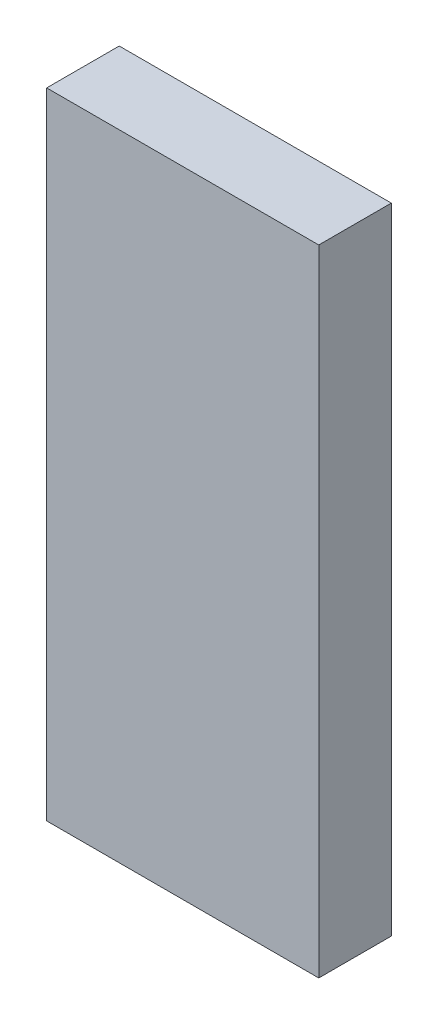
ISO-10303-21;
HEADER;
FILE_DESCRIPTION(('STEP AP214'),'2;1');
FILE_NAME('part.step','',(''),(''),'','','');
FILE_SCHEMA(('AUTOMOTIVE_DESIGN { 1 0 10303 214 1 1 1 1 }'));
ENDSEC;
DATA;
#1=APPLICATION_CONTEXT('core data for automotive mechanical design processes');
#2=APPLICATION_PROTOCOL_DEFINITION('international standard','automotive_design',2000,#1);
#3=PRODUCT_CONTEXT('',#1,'mechanical');
#4=PRODUCT('Part','Part','',(#3));
#5=PRODUCT_RELATED_PRODUCT_CATEGORY('part','',(#4));
#6=PRODUCT_DEFINITION_FORMATION('','',#4);
#7=PRODUCT_DEFINITION_CONTEXT('part definition',#1,'design');
#8=PRODUCT_DEFINITION('design','',#6,#7);
#9=PRODUCT_DEFINITION_SHAPE('','',#8);
#10=(LENGTH_UNIT() NAMED_UNIT(*) SI_UNIT(.MILLI.,.METRE.));
#11=(NAMED_UNIT(*) PLANE_ANGLE_UNIT() SI_UNIT($,.RADIAN.));
#12=(NAMED_UNIT(*) SI_UNIT($,.STERADIAN.) SOLID_ANGLE_UNIT());
#13=UNCERTAINTY_MEASURE_WITH_UNIT(LENGTH_MEASURE(1.E-05),#10,'distance_accuracy_value','');
#14=(GEOMETRIC_REPRESENTATION_CONTEXT(3) GLOBAL_UNCERTAINTY_ASSIGNED_CONTEXT((#13)) GLOBAL_UNIT_ASSIGNED_CONTEXT((#10,
#11,#12)) REPRESENTATION_CONTEXT('',''));
#15=CARTESIAN_POINT('',(0.,0.,0.));
#16=DIRECTION('',(0.,0.,1.));
#17=DIRECTION('',(1.,0.,0.));
#18=AXIS2_PLACEMENT_3D('',#15,#16,#17);
#19=CARTESIAN_POINT('',(0.67499992,-1.57500066,0.));
#20=DIRECTION('',(-1.,0.,0.));
#21=DIRECTION('',(0.,1.,0.));
#22=AXIS2_PLACEMENT_3D('',#19,#20,#21);
#23=PLANE('',#22);
#24=DIRECTION('',(0.,1.,0.));
#25=VECTOR('',#24,1.);
#26=CARTESIAN_POINT('',(0.67499992,-1.57500066,0.));
#27=LINE('',#26,#25);
#28=CARTESIAN_POINT('',(0.67499992,-1.57500066,0.));
#29=VERTEX_POINT('',#28);
#30=CARTESIAN_POINT('',(0.67499992,1.57500066,0.));
#31=VERTEX_POINT('',#30);
#32=EDGE_CURVE('E11',#29,#31,#27,.T.);
#33=ORIENTED_EDGE('',*,*,#32,.T.);
#34=DIRECTION('',(0.,0.,1.));
#35=VECTOR('',#34,1.);
#36=CARTESIAN_POINT('',(0.67499992,1.57500066,0.));
#37=LINE('',#36,#35);
#38=CARTESIAN_POINT('',(0.67499992,1.57500066,0.35999928));
#39=VERTEX_POINT('',#38);
#40=EDGE_CURVE('E24',#31,#39,#37,.T.);
#41=ORIENTED_EDGE('',*,*,#40,.T.);
#42=DIRECTION('',(0.,1.,0.));
#43=VECTOR('',#42,1.);
#44=CARTESIAN_POINT('',(0.67499992,-1.57500066,0.35999928));
#45=LINE('',#44,#43);
#46=CARTESIAN_POINT('',(0.67499992,-1.57500066,0.35999928));
#47=VERTEX_POINT('',#46);
#48=EDGE_CURVE('E87',#47,#39,#45,.T.);
#49=ORIENTED_EDGE('',*,*,#48,.F.);
#50=DIRECTION('',(0.,0.,1.));
#51=VECTOR('',#50,1.);
#52=CARTESIAN_POINT('',(0.67499992,-1.57500066,0.));
#53=LINE('',#52,#51);
#54=EDGE_CURVE('E36',#29,#47,#53,.T.);
#55=ORIENTED_EDGE('',*,*,#54,.F.);
#56=EDGE_LOOP('',(#33,#41,#49,#55));
#57=FACE_BOUND('',#56,.T.);
#58=ADVANCED_FACE('F17',(#57),#23,.F.);
#59=CARTESIAN_POINT('',(0.67499992,1.57500066,0.));
#60=DIRECTION('',(0.,-1.,0.));
#61=DIRECTION('',(-1.,0.,0.));
#62=AXIS2_PLACEMENT_3D('',#59,#60,#61);
#63=PLANE('',#62);
#64=DIRECTION('',(-1.,0.,0.));
#65=VECTOR('',#64,1.);
#66=CARTESIAN_POINT('',(0.67499992,1.57500066,0.));
#67=LINE('',#66,#65);
#68=CARTESIAN_POINT('',(-0.67499992,1.57500066,0.));
#69=VERTEX_POINT('',#68);
#70=EDGE_CURVE('E84',#31,#69,#67,.T.);
#71=ORIENTED_EDGE('',*,*,#70,.T.);
#72=DIRECTION('',(0.,0.,1.));
#73=VECTOR('',#72,1.);
#74=CARTESIAN_POINT('',(-0.67499992,1.57500066,0.));
#75=LINE('',#74,#73);
#76=CARTESIAN_POINT('',(-0.67499992,1.57500066,0.35999928));
#77=VERTEX_POINT('',#76);
#78=EDGE_CURVE('E82',#69,#77,#75,.T.);
#79=ORIENTED_EDGE('',*,*,#78,.T.);
#80=DIRECTION('',(-1.,0.,0.));
#81=VECTOR('',#80,1.);
#82=CARTESIAN_POINT('',(0.67499992,1.57500066,0.35999928));
#83=LINE('',#82,#81);
#84=EDGE_CURVE('E62',#39,#77,#83,.T.);
#85=ORIENTED_EDGE('',*,*,#84,.F.);
#86=ORIENTED_EDGE('',*,*,#40,.F.);
#87=EDGE_LOOP('',(#71,#79,#85,#86));
#88=FACE_BOUND('',#87,.T.);
#89=ADVANCED_FACE('F89',(#88),#63,.F.);
#90=CARTESIAN_POINT('',(-0.67499992,1.57500066,0.));
#91=DIRECTION('',(1.,0.,0.));
#92=DIRECTION('',(0.,-1.,0.));
#93=AXIS2_PLACEMENT_3D('',#90,#91,#92);
#94=PLANE('',#93);
#95=DIRECTION('',(0.,-1.,0.));
#96=VECTOR('',#95,1.);
#97=CARTESIAN_POINT('',(-0.67499992,1.57500066,0.));
#98=LINE('',#97,#96);
#99=CARTESIAN_POINT('',(-0.67499992,-1.57500066,0.));
#100=VERTEX_POINT('',#99);
#101=EDGE_CURVE('E71',#69,#100,#98,.T.);
#102=ORIENTED_EDGE('',*,*,#101,.T.);
#103=DIRECTION('',(0.,0.,1.));
#104=VECTOR('',#103,1.);
#105=CARTESIAN_POINT('',(-0.67499992,-1.57500066,0.));
#106=LINE('',#105,#104);
#107=CARTESIAN_POINT('',(-0.67499992,-1.57500066,0.35999928));
#108=VERTEX_POINT('',#107);
#109=EDGE_CURVE('E65',#100,#108,#106,.T.);
#110=ORIENTED_EDGE('',*,*,#109,.T.);
#111=DIRECTION('',(0.,-1.,0.));
#112=VECTOR('',#111,1.);
#113=CARTESIAN_POINT('',(-0.67499992,1.57500066,0.35999928));
#114=LINE('',#113,#112);
#115=EDGE_CURVE('E57',#77,#108,#114,.T.);
#116=ORIENTED_EDGE('',*,*,#115,.F.);
#117=ORIENTED_EDGE('',*,*,#78,.F.);
#118=EDGE_LOOP('',(#102,#110,#116,#117));
#119=FACE_BOUND('',#118,.T.);
#120=ADVANCED_FACE('F69',(#119),#94,.F.);
#121=CARTESIAN_POINT('',(-0.67499992,-1.57500066,0.));
#122=DIRECTION('',(0.,1.,0.));
#123=DIRECTION('',(1.,0.,0.));
#124=AXIS2_PLACEMENT_3D('',#121,#122,#123);
#125=PLANE('',#124);
#126=DIRECTION('',(1.,0.,0.));
#127=VECTOR('',#126,1.);
#128=CARTESIAN_POINT('',(-0.67499992,-1.57500066,0.));
#129=LINE('',#128,#127);
#130=EDGE_CURVE('E66',#100,#29,#129,.T.);
#131=ORIENTED_EDGE('',*,*,#130,.T.);
#132=ORIENTED_EDGE('',*,*,#54,.T.);
#133=DIRECTION('',(1.,0.,0.));
#134=VECTOR('',#133,1.);
#135=CARTESIAN_POINT('',(-0.67499992,-1.57500066,0.35999928));
#136=LINE('',#135,#134);
#137=EDGE_CURVE('E61',#108,#47,#136,.T.);
#138=ORIENTED_EDGE('',*,*,#137,.F.);
#139=ORIENTED_EDGE('',*,*,#109,.F.);
#140=EDGE_LOOP('',(#131,#132,#138,#139));
#141=FACE_BOUND('',#140,.T.);
#142=ADVANCED_FACE('F76',(#141),#125,.F.);
#143=CARTESIAN_POINT('',(0.,0.,0.));
#144=DIRECTION('',(0.,0.,1.));
#145=DIRECTION('',(1.,0.,0.));
#146=AXIS2_PLACEMENT_3D('',#143,#144,#145);
#147=PLANE('',#146);
#148=ORIENTED_EDGE('',*,*,#130,.F.);
#149=ORIENTED_EDGE('',*,*,#101,.F.);
#150=ORIENTED_EDGE('',*,*,#70,.F.);
#151=ORIENTED_EDGE('',*,*,#32,.F.);
#152=EDGE_LOOP('',(#148,#149,#150,#151));
#153=FACE_BOUND('',#152,.T.);
#154=ADVANCED_FACE('F91',(#153),#147,.F.);
#155=CARTESIAN_POINT('',(0.,0.,0.35999928));
#156=DIRECTION('',(0.,0.,1.));
#157=DIRECTION('',(1.,0.,0.));
#158=AXIS2_PLACEMENT_3D('',#155,#156,#157);
#159=PLANE('',#158);
#160=ORIENTED_EDGE('',*,*,#48,.T.);
#161=ORIENTED_EDGE('',*,*,#84,.T.);
#162=ORIENTED_EDGE('',*,*,#115,.T.);
#163=ORIENTED_EDGE('',*,*,#137,.T.);
#164=EDGE_LOOP('',(#160,#161,#162,#163));
#165=FACE_BOUND('',#164,.T.);
#166=ADVANCED_FACE('F59',(#165),#159,.T.);
#167=CLOSED_SHELL('',(#58,#89,#120,#142,#154,#166));
#168=MANIFOLD_SOLID_BREP('B1',#167);
#169=ADVANCED_BREP_SHAPE_REPRESENTATION('',(#18,#168),#14);
#170=SHAPE_DEFINITION_REPRESENTATION(#9,#169);
ENDSEC;
END-ISO-10303-21;
